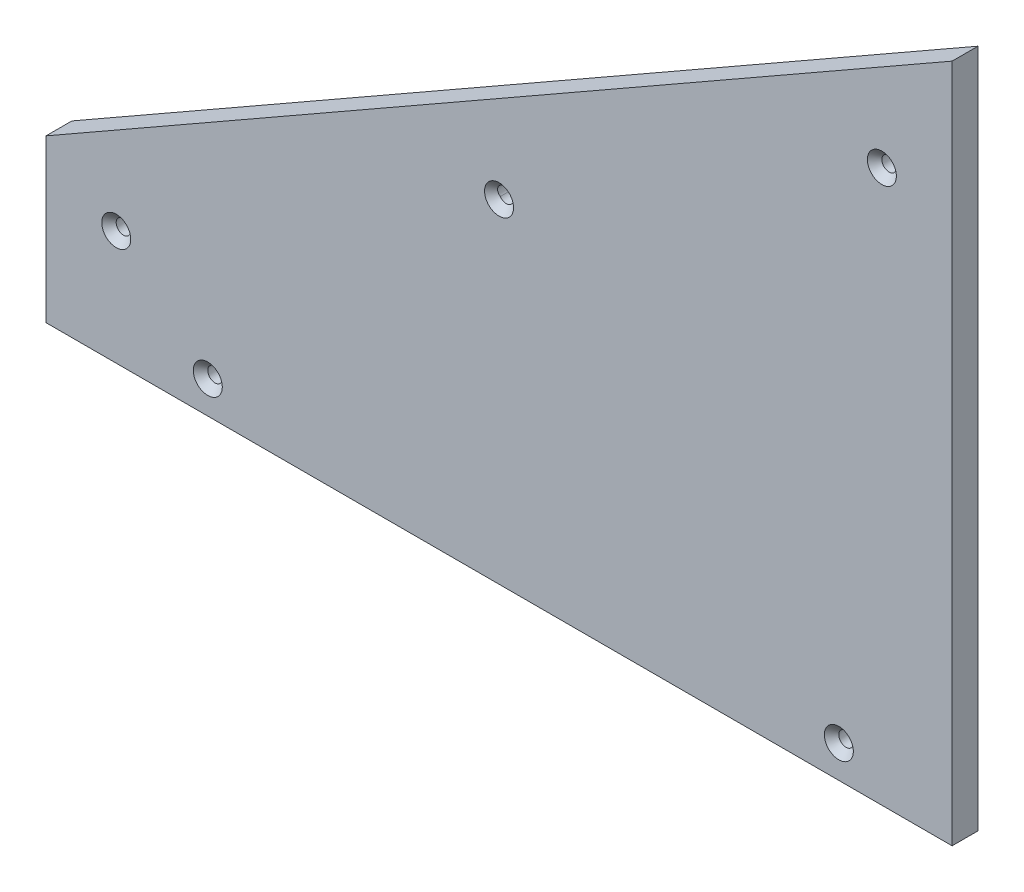
ISO-10303-21;
HEADER;
FILE_DESCRIPTION(('STEP AP214'),'2;1');
FILE_NAME('part.step','',(''),(''),'','','');
FILE_SCHEMA(('AUTOMOTIVE_DESIGN { 1 0 10303 214 1 1 1 1 }'));
ENDSEC;
DATA;
#1=APPLICATION_CONTEXT('core data for automotive mechanical design processes');
#2=APPLICATION_PROTOCOL_DEFINITION('international standard','automotive_design',2000,#1);
#3=PRODUCT_CONTEXT('',#1,'mechanical');
#4=PRODUCT('Part','Part','',(#3));
#5=PRODUCT_RELATED_PRODUCT_CATEGORY('part','',(#4));
#6=PRODUCT_DEFINITION_FORMATION('','',#4);
#7=PRODUCT_DEFINITION_CONTEXT('part definition',#1,'design');
#8=PRODUCT_DEFINITION('design','',#6,#7);
#9=PRODUCT_DEFINITION_SHAPE('','',#8);
#10=(LENGTH_UNIT() NAMED_UNIT(*) SI_UNIT(.MILLI.,.METRE.));
#11=(NAMED_UNIT(*) PLANE_ANGLE_UNIT() SI_UNIT($,.RADIAN.));
#12=(NAMED_UNIT(*) SI_UNIT($,.STERADIAN.) SOLID_ANGLE_UNIT());
#13=UNCERTAINTY_MEASURE_WITH_UNIT(LENGTH_MEASURE(1.E-05),#10,'distance_accuracy_value','');
#14=(GEOMETRIC_REPRESENTATION_CONTEXT(3) GLOBAL_UNCERTAINTY_ASSIGNED_CONTEXT((#13)) GLOBAL_UNIT_ASSIGNED_CONTEXT((#10,
#11,#12)) REPRESENTATION_CONTEXT('',''));
#15=CARTESIAN_POINT('',(0.,0.,0.));
#16=DIRECTION('',(0.,0.,1.));
#17=DIRECTION('',(1.,0.,0.));
#18=AXIS2_PLACEMENT_3D('',#15,#16,#17);
#19=CARTESIAN_POINT('',(0.,0.,0.));
#20=DIRECTION('',(0.,0.,1.));
#21=DIRECTION('',(1.,0.,0.));
#22=AXIS2_PLACEMENT_3D('',#19,#20,#21);
#23=PLANE('',#22);
#24=CARTESIAN_POINT('',(139.792651332237,103.260866722493,0.));
#25=DIRECTION('',(0.,0.,-1.));
#26=DIRECTION('',(-1.,0.,0.));
#27=AXIS2_PLACEMENT_3D('',#24,#25,#26);
#28=CIRCLE('',#27,4.48000000000001);
#29=CARTESIAN_POINT('',(135.312651332237,103.260866722493,0.));
#30=VERTEX_POINT('',#29);
#31=EDGE_CURVE('E363',#30,#30,#28,.T.);
#32=ORIENTED_EDGE('',*,*,#31,.F.);
#33=EDGE_LOOP('',(#32));
#34=FACE_BOUND('',#33,.T.);
#35=DIRECTION('',(0.,1.,0.));
#36=VECTOR('',#35,1.);
#37=CARTESIAN_POINT('',(0.,0.,0.));
#38=LINE('',#37,#36);
#39=CARTESIAN_POINT('',(0.,0.,0.));
#40=VERTEX_POINT('',#39);
#41=CARTESIAN_POINT('',(0.,50.,0.));
#42=VERTEX_POINT('',#41);
#43=EDGE_CURVE('E87',#40,#42,#38,.T.);
#44=ORIENTED_EDGE('',*,*,#43,.T.);
#45=DIRECTION('',(-0.868243142124459,-0.496138938356834,0.));
#46=VECTOR('',#45,1.);
#47=CARTESIAN_POINT('',(0.,50.,0.));
#48=LINE('',#47,#46);
#49=CARTESIAN_POINT('',(280.,210.,0.));
#50=VERTEX_POINT('',#49);
#51=EDGE_CURVE('E100',#50,#42,#48,.T.);
#52=ORIENTED_EDGE('',*,*,#51,.F.);
#53=DIRECTION('',(0.,1.,0.));
#54=VECTOR('',#53,1.);
#55=CARTESIAN_POINT('',(280.,0.,0.));
#56=LINE('',#55,#54);
#57=CARTESIAN_POINT('',(280.,0.,0.));
#58=VERTEX_POINT('',#57);
#59=EDGE_CURVE('E86',#58,#50,#56,.T.);
#60=ORIENTED_EDGE('',*,*,#59,.F.);
#61=DIRECTION('',(1.,0.,0.));
#62=VECTOR('',#61,1.);
#63=CARTESIAN_POINT('',(0.,0.,0.));
#64=LINE('',#63,#62);
#65=EDGE_CURVE('E76',#40,#58,#64,.T.);
#66=ORIENTED_EDGE('',*,*,#65,.F.);
#67=EDGE_LOOP('',(#44,#52,#60,#66));
#68=FACE_BOUND('',#67,.T.);
#69=CARTESIAN_POINT('',(245.,10.,0.));
#70=DIRECTION('',(0.,0.,-1.));
#71=DIRECTION('',(-1.,0.,0.));
#72=AXIS2_PLACEMENT_3D('',#69,#70,#71);
#73=CIRCLE('',#72,4.48000000000001);
#74=CARTESIAN_POINT('',(240.52,10.,0.));
#75=VERTEX_POINT('',#74);
#76=EDGE_CURVE('E386',#75,#75,#73,.T.);
#77=ORIENTED_EDGE('',*,*,#76,.F.);
#78=EDGE_LOOP('',(#77));
#79=FACE_BOUND('',#78,.T.);
#80=CARTESIAN_POINT('',(50.,10.,0.));
#81=DIRECTION('',(0.,0.,-1.));
#82=DIRECTION('',(-1.,0.,0.));
#83=AXIS2_PLACEMENT_3D('',#80,#81,#82);
#84=CIRCLE('',#83,4.48);
#85=CARTESIAN_POINT('',(45.52,10.,0.));
#86=VERTEX_POINT('',#85);
#87=EDGE_CURVE('E380',#86,#86,#84,.T.);
#88=ORIENTED_EDGE('',*,*,#87,.F.);
#89=EDGE_LOOP('',(#88));
#90=FACE_BOUND('',#89,.T.);
#91=CARTESIAN_POINT('',(21.7060785531115,35.4034734589208,0.));
#92=DIRECTION('',(0.,0.,-1.));
#93=DIRECTION('',(-1.,0.,0.));
#94=AXIS2_PLACEMENT_3D('',#91,#92,#93);
#95=CIRCLE('',#94,4.48);
#96=CARTESIAN_POINT('',(17.2260785531115,35.4034734589208,0.));
#97=VERTEX_POINT('',#96);
#98=EDGE_CURVE('E374',#97,#97,#95,.T.);
#99=ORIENTED_EDGE('',*,*,#98,.F.);
#100=EDGE_LOOP('',(#99));
#101=FACE_BOUND('',#100,.T.);
#102=CARTESIAN_POINT('',(258.293921446889,170.596526541079,0.));
#103=DIRECTION('',(0.,0.,-1.));
#104=DIRECTION('',(-1.,0.,0.));
#105=AXIS2_PLACEMENT_3D('',#102,#103,#104);
#106=CIRCLE('',#105,4.47999999999998);
#107=CARTESIAN_POINT('',(253.813921446889,170.596526541079,0.));
#108=VERTEX_POINT('',#107);
#109=EDGE_CURVE('E368',#108,#108,#106,.T.);
#110=ORIENTED_EDGE('',*,*,#109,.F.);
#111=EDGE_LOOP('',(#110));
#112=FACE_BOUND('',#111,.T.);
#113=ADVANCED_FACE('F34',(#34,#68,#79,#90,#101,#112),#23,.F.);
#114=CARTESIAN_POINT('',(0.,0.,8.));
#115=DIRECTION('',(-1.,0.,0.));
#116=DIRECTION('',(0.,0.,1.));
#117=AXIS2_PLACEMENT_3D('',#114,#115,#116);
#118=PLANE('',#117);
#119=ORIENTED_EDGE('',*,*,#43,.F.);
#120=DIRECTION('',(0.,0.,-1.));
#121=VECTOR('',#120,1.);
#122=CARTESIAN_POINT('',(0.,0.,8.));
#123=LINE('',#122,#121);
#124=CARTESIAN_POINT('',(0.,0.,8.));
#125=VERTEX_POINT('',#124);
#126=EDGE_CURVE('E81',#125,#40,#123,.T.);
#127=ORIENTED_EDGE('',*,*,#126,.F.);
#128=DIRECTION('',(0.,1.,0.));
#129=VECTOR('',#128,1.);
#130=CARTESIAN_POINT('',(0.,0.,8.));
#131=LINE('',#130,#129);
#132=CARTESIAN_POINT('',(0.,50.,8.));
#133=VERTEX_POINT('',#132);
#134=EDGE_CURVE('E101',#125,#133,#131,.T.);
#135=ORIENTED_EDGE('',*,*,#134,.T.);
#136=DIRECTION('',(0.,0.,1.));
#137=VECTOR('',#136,1.);
#138=CARTESIAN_POINT('',(0.,50.,0.));
#139=LINE('',#138,#137);
#140=EDGE_CURVE('E409',#42,#133,#139,.T.);
#141=ORIENTED_EDGE('',*,*,#140,.F.);
#142=EDGE_LOOP('',(#119,#127,#135,#141));
#143=FACE_BOUND('',#142,.T.);
#144=ADVANCED_FACE('F36',(#143),#118,.T.);
#145=CARTESIAN_POINT('',(0.,0.,8.));
#146=DIRECTION('',(0.,1.,0.));
#147=DIRECTION('',(0.,0.,1.));
#148=AXIS2_PLACEMENT_3D('',#145,#146,#147);
#149=PLANE('',#148);
#150=ORIENTED_EDGE('',*,*,#65,.T.);
#151=DIRECTION('',(0.,0.,-1.));
#152=VECTOR('',#151,1.);
#153=CARTESIAN_POINT('',(280.,0.,8.));
#154=LINE('',#153,#152);
#155=CARTESIAN_POINT('',(280.,0.,8.));
#156=VERTEX_POINT('',#155);
#157=EDGE_CURVE('E79',#156,#58,#154,.T.);
#158=ORIENTED_EDGE('',*,*,#157,.F.);
#159=DIRECTION('',(1.,0.,0.));
#160=VECTOR('',#159,1.);
#161=CARTESIAN_POINT('',(0.,0.,8.));
#162=LINE('',#161,#160);
#163=EDGE_CURVE('E63',#125,#156,#162,.T.);
#164=ORIENTED_EDGE('',*,*,#163,.F.);
#165=ORIENTED_EDGE('',*,*,#126,.T.);
#166=EDGE_LOOP('',(#150,#158,#164,#165));
#167=FACE_BOUND('',#166,.T.);
#168=ADVANCED_FACE('F78',(#167),#149,.F.);
#169=CARTESIAN_POINT('',(280.,0.,8.));
#170=DIRECTION('',(-1.,0.,0.));
#171=DIRECTION('',(0.,0.,1.));
#172=AXIS2_PLACEMENT_3D('',#169,#170,#171);
#173=PLANE('',#172);
#174=ORIENTED_EDGE('',*,*,#59,.T.);
#175=DIRECTION('',(0.,0.,1.));
#176=VECTOR('',#175,1.);
#177=CARTESIAN_POINT('',(280.,210.,0.));
#178=LINE('',#177,#176);
#179=CARTESIAN_POINT('',(280.,210.,8.));
#180=VERTEX_POINT('',#179);
#181=EDGE_CURVE('E406',#50,#180,#178,.T.);
#182=ORIENTED_EDGE('',*,*,#181,.T.);
#183=DIRECTION('',(0.,1.,0.));
#184=VECTOR('',#183,1.);
#185=CARTESIAN_POINT('',(280.,0.,8.));
#186=LINE('',#185,#184);
#187=EDGE_CURVE('E95',#156,#180,#186,.T.);
#188=ORIENTED_EDGE('',*,*,#187,.F.);
#189=ORIENTED_EDGE('',*,*,#157,.T.);
#190=EDGE_LOOP('',(#174,#182,#188,#189));
#191=FACE_BOUND('',#190,.T.);
#192=ADVANCED_FACE('F91',(#191),#173,.F.);
#193=CARTESIAN_POINT('',(0.,0.,8.));
#194=DIRECTION('',(0.,0.,1.));
#195=DIRECTION('',(1.,0.,0.));
#196=AXIS2_PLACEMENT_3D('',#193,#194,#195);
#197=PLANE('',#196);
#198=CARTESIAN_POINT('',(140.,103.,8.));
#199=DIRECTION('',(0.,0.,1.));
#200=DIRECTION('',(1.,0.,0.));
#201=AXIS2_PLACEMENT_3D('',#198,#199,#200);
#202=CIRCLE('',#201,4.48000000000001);
#203=CARTESIAN_POINT('',(144.48,103.,8.));
#204=VERTEX_POINT('',#203);
#205=EDGE_CURVE('E357',#204,#204,#202,.T.);
#206=ORIENTED_EDGE('',*,*,#205,.F.);
#207=EDGE_LOOP('',(#206));
#208=FACE_BOUND('',#207,.T.);
#209=CARTESIAN_POINT('',(21.7060785531115,35.4034734589208,8.));
#210=DIRECTION('',(0.,0.,1.));
#211=DIRECTION('',(1.,0.,0.));
#212=AXIS2_PLACEMENT_3D('',#209,#210,#211);
#213=CIRCLE('',#212,4.48);
#214=CARTESIAN_POINT('',(26.1860785531115,35.4034734589208,8.));
#215=VERTEX_POINT('',#214);
#216=EDGE_CURVE('E392',#215,#215,#213,.T.);
#217=ORIENTED_EDGE('',*,*,#216,.F.);
#218=EDGE_LOOP('',(#217));
#219=FACE_BOUND('',#218,.T.);
#220=CARTESIAN_POINT('',(258.293921446889,170.596526541079,8.));
#221=DIRECTION('',(0.,0.,1.));
#222=DIRECTION('',(1.,0.,0.));
#223=AXIS2_PLACEMENT_3D('',#220,#221,#222);
#224=CIRCLE('',#223,4.47999999999998);
#225=CARTESIAN_POINT('',(262.773921446889,170.596526541079,8.));
#226=VERTEX_POINT('',#225);
#227=EDGE_CURVE('E398',#226,#226,#224,.T.);
#228=ORIENTED_EDGE('',*,*,#227,.F.);
#229=EDGE_LOOP('',(#228));
#230=FACE_BOUND('',#229,.T.);
#231=CARTESIAN_POINT('',(50.,10.,8.));
#232=DIRECTION('',(0.,0.,1.));
#233=DIRECTION('',(1.,0.,0.));
#234=AXIS2_PLACEMENT_3D('',#231,#232,#233);
#235=CIRCLE('',#234,4.48);
#236=CARTESIAN_POINT('',(54.48,10.,8.));
#237=VERTEX_POINT('',#236);
#238=EDGE_CURVE('E412',#237,#237,#235,.T.);
#239=ORIENTED_EDGE('',*,*,#238,.F.);
#240=EDGE_LOOP('',(#239));
#241=FACE_BOUND('',#240,.T.);
#242=CARTESIAN_POINT('',(245.,10.,8.));
#243=DIRECTION('',(0.,0.,1.));
#244=DIRECTION('',(1.,0.,0.));
#245=AXIS2_PLACEMENT_3D('',#242,#243,#244);
#246=CIRCLE('',#245,4.48000000000001);
#247=CARTESIAN_POINT('',(249.48,10.,8.));
#248=VERTEX_POINT('',#247);
#249=EDGE_CURVE('E419',#248,#248,#246,.T.);
#250=ORIENTED_EDGE('',*,*,#249,.F.);
#251=EDGE_LOOP('',(#250));
#252=FACE_BOUND('',#251,.T.);
#253=ORIENTED_EDGE('',*,*,#187,.T.);
#254=DIRECTION('',(-0.868243142124459,-0.496138938356834,0.));
#255=VECTOR('',#254,1.);
#256=CARTESIAN_POINT('',(0.,50.,8.));
#257=LINE('',#256,#255);
#258=EDGE_CURVE('E404',#180,#133,#257,.T.);
#259=ORIENTED_EDGE('',*,*,#258,.T.);
#260=ORIENTED_EDGE('',*,*,#134,.F.);
#261=ORIENTED_EDGE('',*,*,#163,.T.);
#262=EDGE_LOOP('',(#253,#259,#260,#261));
#263=FACE_BOUND('',#262,.T.);
#264=ADVANCED_FACE('F138',(#208,#219,#230,#241,#252,#263),#197,.T.);
#265=CARTESIAN_POINT('',(245.,10.,8.));
#266=DIRECTION('',(0.,0.,1.));
#267=DIRECTION('',(1.,0.,0.));
#268=AXIS2_PLACEMENT_3D('',#265,#266,#267);
#269=CYLINDRICAL_SURFACE('',#268,2.25);
#270=CARTESIAN_POINT('',(245.,10.,2.23000000000001));
#271=DIRECTION('',(0.,0.,-1.));
#272=DIRECTION('',(-1.,0.,0.));
#273=AXIS2_PLACEMENT_3D('',#270,#271,#272);
#274=CIRCLE('',#273,2.25);
#275=CARTESIAN_POINT('',(242.75,10.,2.23000000000001));
#276=VERTEX_POINT('',#275);
#277=EDGE_CURVE('E389',#276,#276,#274,.T.);
#278=ORIENTED_EDGE('',*,*,#277,.T.);
#279=EDGE_LOOP('',(#278));
#280=FACE_BOUND('',#279,.T.);
#281=CARTESIAN_POINT('',(245.,10.,5.76999999999999));
#282=DIRECTION('',(0.,0.,1.));
#283=DIRECTION('',(1.,0.,0.));
#284=AXIS2_PLACEMENT_3D('',#281,#282,#283);
#285=CIRCLE('',#284,2.25);
#286=CARTESIAN_POINT('',(247.25,10.,5.76999999999999));
#287=VERTEX_POINT('',#286);
#288=EDGE_CURVE('E422',#287,#287,#285,.T.);
#289=ORIENTED_EDGE('',*,*,#288,.T.);
#290=EDGE_LOOP('',(#289));
#291=FACE_BOUND('',#290,.T.);
#292=ADVANCED_FACE('F158',(#280,#291),#269,.F.);
#293=CARTESIAN_POINT('',(245.,10.,8.));
#294=DIRECTION('',(0.,0.,1.));
#295=DIRECTION('',(1.,0.,0.));
#296=AXIS2_PLACEMENT_3D('',#293,#294,#295);
#297=CONICAL_SURFACE('',#296,4.48000000000001,0.785398163397448);
#298=ORIENTED_EDGE('',*,*,#288,.F.);
#299=EDGE_LOOP('',(#298));
#300=FACE_BOUND('',#299,.T.);
#301=ORIENTED_EDGE('',*,*,#249,.T.);
#302=EDGE_LOOP('',(#301));
#303=FACE_BOUND('',#302,.T.);
#304=ADVANCED_FACE('F166',(#300,#303),#297,.F.);
#305=CARTESIAN_POINT('',(50.,10.,8.));
#306=DIRECTION('',(0.,0.,1.));
#307=DIRECTION('',(1.,0.,0.));
#308=AXIS2_PLACEMENT_3D('',#305,#306,#307);
#309=CYLINDRICAL_SURFACE('',#308,2.25);
#310=CARTESIAN_POINT('',(50.,10.,2.23000000000001));
#311=DIRECTION('',(0.,0.,-1.));
#312=DIRECTION('',(-1.,0.,0.));
#313=AXIS2_PLACEMENT_3D('',#310,#311,#312);
#314=CIRCLE('',#313,2.24999999999999);
#315=CARTESIAN_POINT('',(47.75,10.,2.23000000000001));
#316=VERTEX_POINT('',#315);
#317=EDGE_CURVE('E383',#316,#316,#314,.T.);
#318=ORIENTED_EDGE('',*,*,#317,.T.);
#319=EDGE_LOOP('',(#318));
#320=FACE_BOUND('',#319,.T.);
#321=CARTESIAN_POINT('',(50.,10.,5.76999999999999));
#322=DIRECTION('',(0.,0.,1.));
#323=DIRECTION('',(1.,0.,0.));
#324=AXIS2_PLACEMENT_3D('',#321,#322,#323);
#325=CIRCLE('',#324,2.24999999999999);
#326=CARTESIAN_POINT('',(52.25,10.,5.76999999999999));
#327=VERTEX_POINT('',#326);
#328=EDGE_CURVE('E416',#327,#327,#325,.T.);
#329=ORIENTED_EDGE('',*,*,#328,.T.);
#330=EDGE_LOOP('',(#329));
#331=FACE_BOUND('',#330,.T.);
#332=ADVANCED_FACE('F174',(#320,#331),#309,.F.);
#333=CARTESIAN_POINT('',(50.,10.,8.));
#334=DIRECTION('',(0.,0.,1.));
#335=DIRECTION('',(1.,0.,0.));
#336=AXIS2_PLACEMENT_3D('',#333,#334,#335);
#337=CONICAL_SURFACE('',#336,4.48,0.785398163397448);
#338=ORIENTED_EDGE('',*,*,#328,.F.);
#339=EDGE_LOOP('',(#338));
#340=FACE_BOUND('',#339,.T.);
#341=ORIENTED_EDGE('',*,*,#238,.T.);
#342=EDGE_LOOP('',(#341));
#343=FACE_BOUND('',#342,.T.);
#344=ADVANCED_FACE('F183',(#340,#343),#337,.F.);
#345=CARTESIAN_POINT('',(0.,50.,0.));
#346=DIRECTION('',(-0.496138938356834,0.868243142124459,0.));
#347=DIRECTION('',(-0.868243142124459,-0.496138938356834,0.));
#348=AXIS2_PLACEMENT_3D('',#345,#346,#347);
#349=PLANE('',#348);
#350=ORIENTED_EDGE('',*,*,#258,.F.);
#351=ORIENTED_EDGE('',*,*,#181,.F.);
#352=ORIENTED_EDGE('',*,*,#51,.T.);
#353=ORIENTED_EDGE('',*,*,#140,.T.);
#354=EDGE_LOOP('',(#350,#351,#352,#353));
#355=FACE_BOUND('',#354,.T.);
#356=ADVANCED_FACE('F191',(#355),#349,.T.);
#357=CARTESIAN_POINT('',(258.293921446889,170.596526541079,8.));
#358=DIRECTION('',(0.,0.,1.));
#359=DIRECTION('',(1.,0.,0.));
#360=AXIS2_PLACEMENT_3D('',#357,#358,#359);
#361=CYLINDRICAL_SURFACE('',#360,2.24999999999997);
#362=CARTESIAN_POINT('',(258.293921446889,170.596526541079,2.23000000000001));
#363=DIRECTION('',(0.,0.,-1.));
#364=DIRECTION('',(-1.,0.,0.));
#365=AXIS2_PLACEMENT_3D('',#362,#363,#364);
#366=CIRCLE('',#365,2.24999999999997);
#367=CARTESIAN_POINT('',(256.043921446889,170.596526541079,2.23000000000001));
#368=VERTEX_POINT('',#367);
#369=EDGE_CURVE('E371',#368,#368,#366,.T.);
#370=ORIENTED_EDGE('',*,*,#369,.T.);
#371=EDGE_LOOP('',(#370));
#372=FACE_BOUND('',#371,.T.);
#373=CARTESIAN_POINT('',(258.293921446889,170.596526541079,5.77));
#374=DIRECTION('',(0.,0.,1.));
#375=DIRECTION('',(1.,0.,0.));
#376=AXIS2_PLACEMENT_3D('',#373,#374,#375);
#377=CIRCLE('',#376,2.24999999999997);
#378=CARTESIAN_POINT('',(260.543921446889,170.596526541079,5.77));
#379=VERTEX_POINT('',#378);
#380=EDGE_CURVE('E401',#379,#379,#377,.T.);
#381=ORIENTED_EDGE('',*,*,#380,.T.);
#382=EDGE_LOOP('',(#381));
#383=FACE_BOUND('',#382,.T.);
#384=ADVANCED_FACE('F198',(#372,#383),#361,.F.);
#385=CARTESIAN_POINT('',(258.293921446889,170.596526541079,8.));
#386=DIRECTION('',(0.,0.,1.));
#387=DIRECTION('',(1.,0.,0.));
#388=AXIS2_PLACEMENT_3D('',#385,#386,#387);
#389=CONICAL_SURFACE('',#388,4.47999999999998,0.78539816339745);
#390=ORIENTED_EDGE('',*,*,#380,.F.);
#391=EDGE_LOOP('',(#390));
#392=FACE_BOUND('',#391,.T.);
#393=ORIENTED_EDGE('',*,*,#227,.T.);
#394=EDGE_LOOP('',(#393));
#395=FACE_BOUND('',#394,.T.);
#396=ADVANCED_FACE('F206',(#392,#395),#389,.F.);
#397=CARTESIAN_POINT('',(21.7060785531115,35.4034734589208,8.));
#398=DIRECTION('',(0.,0.,1.));
#399=DIRECTION('',(1.,0.,0.));
#400=AXIS2_PLACEMENT_3D('',#397,#398,#399);
#401=CYLINDRICAL_SURFACE('',#400,2.25);
#402=CARTESIAN_POINT('',(21.7060785531115,35.4034734589208,2.23000000000001));
#403=DIRECTION('',(0.,0.,-1.));
#404=DIRECTION('',(-1.,0.,0.));
#405=AXIS2_PLACEMENT_3D('',#402,#403,#404);
#406=CIRCLE('',#405,2.24999999999999);
#407=CARTESIAN_POINT('',(19.4560785531115,35.4034734589208,2.23000000000001));
#408=VERTEX_POINT('',#407);
#409=EDGE_CURVE('E377',#408,#408,#406,.T.);
#410=ORIENTED_EDGE('',*,*,#409,.T.);
#411=EDGE_LOOP('',(#410));
#412=FACE_BOUND('',#411,.T.);
#413=CARTESIAN_POINT('',(21.7060785531115,35.4034734589208,5.77));
#414=DIRECTION('',(0.,0.,1.));
#415=DIRECTION('',(1.,0.,0.));
#416=AXIS2_PLACEMENT_3D('',#413,#414,#415);
#417=CIRCLE('',#416,2.25);
#418=CARTESIAN_POINT('',(23.9560785531115,35.4034734589208,5.77));
#419=VERTEX_POINT('',#418);
#420=EDGE_CURVE('E395',#419,#419,#417,.T.);
#421=ORIENTED_EDGE('',*,*,#420,.T.);
#422=EDGE_LOOP('',(#421));
#423=FACE_BOUND('',#422,.T.);
#424=ADVANCED_FACE('F214',(#412,#423),#401,.F.);
#425=CARTESIAN_POINT('',(21.7060785531115,35.4034734589208,8.));
#426=DIRECTION('',(0.,0.,1.));
#427=DIRECTION('',(1.,0.,0.));
#428=AXIS2_PLACEMENT_3D('',#425,#426,#427);
#429=CONICAL_SURFACE('',#428,4.48,0.785398163397449);
#430=ORIENTED_EDGE('',*,*,#420,.F.);
#431=EDGE_LOOP('',(#430));
#432=FACE_BOUND('',#431,.T.);
#433=ORIENTED_EDGE('',*,*,#216,.T.);
#434=EDGE_LOOP('',(#433));
#435=FACE_BOUND('',#434,.T.);
#436=ADVANCED_FACE('F221',(#432,#435),#429,.F.);
#437=CARTESIAN_POINT('',(245.,10.,0.));
#438=DIRECTION('',(0.,0.,-1.));
#439=DIRECTION('',(-1.,0.,0.));
#440=AXIS2_PLACEMENT_3D('',#437,#438,#439);
#441=CONICAL_SURFACE('',#440,4.48000000000001,0.785398163397448);
#442=ORIENTED_EDGE('',*,*,#277,.F.);
#443=EDGE_LOOP('',(#442));
#444=FACE_BOUND('',#443,.T.);
#445=ORIENTED_EDGE('',*,*,#76,.T.);
#446=EDGE_LOOP('',(#445));
#447=FACE_BOUND('',#446,.T.);
#448=ADVANCED_FACE('F229',(#444,#447),#441,.F.);
#449=CARTESIAN_POINT('',(50.,10.,0.));
#450=DIRECTION('',(0.,0.,-1.));
#451=DIRECTION('',(-1.,0.,0.));
#452=AXIS2_PLACEMENT_3D('',#449,#450,#451);
#453=CONICAL_SURFACE('',#452,4.48,0.785398163397448);
#454=ORIENTED_EDGE('',*,*,#317,.F.);
#455=EDGE_LOOP('',(#454));
#456=FACE_BOUND('',#455,.T.);
#457=ORIENTED_EDGE('',*,*,#87,.T.);
#458=EDGE_LOOP('',(#457));
#459=FACE_BOUND('',#458,.T.);
#460=ADVANCED_FACE('F236',(#456,#459),#453,.F.);
#461=CARTESIAN_POINT('',(21.7060785531115,35.4034734589208,0.));
#462=DIRECTION('',(0.,0.,-1.));
#463=DIRECTION('',(-1.,0.,0.));
#464=AXIS2_PLACEMENT_3D('',#461,#462,#463);
#465=CONICAL_SURFACE('',#464,4.48,0.785398163397449);
#466=ORIENTED_EDGE('',*,*,#409,.F.);
#467=EDGE_LOOP('',(#466));
#468=FACE_BOUND('',#467,.T.);
#469=ORIENTED_EDGE('',*,*,#98,.T.);
#470=EDGE_LOOP('',(#469));
#471=FACE_BOUND('',#470,.T.);
#472=ADVANCED_FACE('F243',(#468,#471),#465,.F.);
#473=CARTESIAN_POINT('',(258.293921446889,170.596526541079,0.));
#474=DIRECTION('',(0.,0.,-1.));
#475=DIRECTION('',(-1.,0.,0.));
#476=AXIS2_PLACEMENT_3D('',#473,#474,#475);
#477=CONICAL_SURFACE('',#476,4.47999999999998,0.785398163397448);
#478=ORIENTED_EDGE('',*,*,#369,.F.);
#479=EDGE_LOOP('',(#478));
#480=FACE_BOUND('',#479,.T.);
#481=ORIENTED_EDGE('',*,*,#109,.T.);
#482=EDGE_LOOP('',(#481));
#483=FACE_BOUND('',#482,.T.);
#484=ADVANCED_FACE('F251',(#480,#483),#477,.F.);
#485=CARTESIAN_POINT('',(139.792651332237,103.260866722493,0.));
#486=DIRECTION('',(0.,0.,-1.));
#487=DIRECTION('',(-1.,0.,0.));
#488=AXIS2_PLACEMENT_3D('',#485,#486,#487);
#489=CYLINDRICAL_SURFACE('',#488,2.24999999999999);
#490=CARTESIAN_POINT('',(142.014092710247,103.618215577347,5.62683647812157));
#491=CARTESIAN_POINT('',(142.005515994241,103.671531219022,5.63428224995144));
#492=CARTESIAN_POINT('',(141.995024735681,103.72450527362,5.64183428295746));
#493=CARTESIAN_POINT('',(141.970271262398,103.829535488644,5.65711101410851));
#494=CARTESIAN_POINT('',(141.956009319731,103.881591715003,5.66483569975982));
#495=CARTESIAN_POINT('',(141.907758972892,104.035702622226,5.6881590669389));
#496=CARTESIAN_POINT('',(141.868248492007,104.136055136751,5.7039568204935));
#497=CARTESIAN_POINT('',(141.773145119358,104.334563163141,5.7364609821096));
#498=CARTESIAN_POINT('',(141.716888149271,104.432397965635,5.75317540779757));
#499=CARTESIAN_POINT('',(141.591731249435,104.616570847915,5.78606532450301));
#500=CARTESIAN_POINT('',(141.52313081491,104.703111688285,5.80224465628069));
#501=CARTESIAN_POINT('',(141.373861697596,104.865375831185,5.83413095445944));
#502=CARTESIAN_POINT('',(141.293176744557,104.941084276386,5.84983724919988));
#503=CARTESIAN_POINT('',(141.107884662131,105.090891609277,5.88288390890583));
#504=CARTESIAN_POINT('',(141.001511734997,105.162851328477,5.90009103329099));
#505=CARTESIAN_POINT('',(140.777912440707,105.287728104277,5.93302983752665));
#506=CARTESIAN_POINT('',(140.660684949888,105.340643186603,5.94876136428346));
#507=CARTESIAN_POINT('',(140.419439875676,105.425558106855,5.97829744477771));
#508=CARTESIAN_POINT('',(140.295466564302,105.457679824856,5.9921128476817));
#509=CARTESIAN_POINT('',(140.043661562126,105.500465139939,6.01761645858034));
#510=CARTESIAN_POINT('',(139.915830164638,105.511130364122,6.02930482781241));
#511=CARTESIAN_POINT('',(139.661136722768,105.510595498259,6.0502076896172));
#512=CARTESIAN_POINT('',(139.53427598342,105.499585909448,6.05944293333173));
#513=CARTESIAN_POINT('',(139.284068788613,105.456307612867,6.0753769537682));
#514=CARTESIAN_POINT('',(139.160722190604,105.424039768714,6.08207583351258));
#515=CARTESIAN_POINT('',(138.922103757076,105.339458019983,6.0927529365162));
#516=CARTESIAN_POINT('',(138.806774843788,105.28730781067,6.09675265661306));
#517=CARTESIAN_POINT('',(138.586431125478,105.164401725712,6.10203527417767));
#518=CARTESIAN_POINT('',(138.481415972669,105.093646477736,6.10331826328551));
#519=CARTESIAN_POINT('',(138.285190267769,104.935928300949,6.10314162219563));
#520=CARTESIAN_POINT('',(138.193916316572,104.849044214284,6.10169503242439));
#521=CARTESIAN_POINT('',(138.02715908287,104.661330211016,6.0961145552288));
#522=CARTESIAN_POINT('',(137.951675715615,104.560500369264,6.0919806822278));
#523=CARTESIAN_POINT('',(137.818612545878,104.347792336483,6.08111076962813));
#524=CARTESIAN_POINT('',(137.761030927322,104.235915267678,6.0743749941396));
#525=CARTESIAN_POINT('',(137.665325348677,104.004295683063,6.05843974996734));
#526=CARTESIAN_POINT('',(137.62720138398,103.884553169116,6.04924028186709));
#527=CARTESIAN_POINT('',(137.571271019672,103.640036488372,6.0285211815154));
#528=CARTESIAN_POINT('',(137.553557119737,103.5152420468,6.01699126247911));
#529=CARTESIAN_POINT('',(137.539156329021,103.264642786159,5.99188000251447));
#530=CARTESIAN_POINT('',(137.542471698998,103.138837859909,5.97829844117692));
#531=CARTESIAN_POINT('',(137.570045195625,102.888741265447,5.94926237054433));
#532=CARTESIAN_POINT('',(137.594470036404,102.764469650988,5.93379379569848));
#533=CARTESIAN_POINT('',(137.663706655917,102.521957830052,5.90141986143296));
#534=CARTESIAN_POINT('',(137.708513997265,102.403716317015,5.88451481539228));
#535=CARTESIAN_POINT('',(137.811455806367,102.188447413451,5.85149479217311));
#536=CARTESIAN_POINT('',(137.867703770766,102.090495073895,5.83548240592306));
#537=CARTESIAN_POINT('',(137.994153947815,101.904193109908,5.80294091116013));
#538=CARTESIAN_POINT('',(138.064348002878,101.815837918261,5.78641210945878));
#539=CARTESIAN_POINT('',(138.197294145133,101.672065570224,5.75748879955632));
#540=CARTESIAN_POINT('',(138.257267846805,101.61404316133,5.74513184431065));
#541=CARTESIAN_POINT('',(138.383224938193,101.505030330218,5.72047842808785));
#542=CARTESIAN_POINT('',(138.449203614872,101.454034470872,5.70818192751755));
#543=CARTESIAN_POINT('',(138.517851919704,101.406847721024,5.69598187398943));
#544=B_SPLINE_CURVE_WITH_KNOTS('',3,(#490,#491,#492,#493,#494,#495,#496,#497,#498,#499,#500,
#501,#502,#503,#504,#505,#506,#507,#508,#509,#510,#511,#512,#513,#514,#515,#516,#517,#518,#519,
#520,#521,#522,#523,#524,#525,#526,#527,#528,#529,#530,#531,#532,#533,#534,#535,#536,#537,#538,
#539,#540,#541,#542,#543),.UNSPECIFIED.,.F.,.F.,(4,2,2,2,2,2,2,2,2,2,2,2,2,2,2,2,2,2,2,2,2,2,2,
2,2,2,4),(0.,0.163464901105582,0.326918011391027,0.65274323653301,0.993763410524441,
1.32741392805563,1.66151776986571,2.04834288918339,2.43520809743258,2.8197846593866,
3.20433205678755,3.5855147302441,3.96668191910055,4.34477638545775,4.72285809782109,
5.0991381156708,5.4754161139466,5.85165592757441,6.22789565209673,6.60583389328067,
6.98381276551641,7.36480432756506,7.74571298526201,8.08674099102195,8.42757010100978,
8.68015785938595,8.93254905489461),.UNSPECIFIED.);
#545=CARTESIAN_POINT('',(141.652864723634,104.526610037097,5.76999999999999));
#546=VERTEX_POINT('',#545);
#547=CARTESIAN_POINT('',(138.139786608603,101.734256685396,5.76999999999999));
#548=VERTEX_POINT('',#547);
#549=EDGE_CURVE('E11',#546,#548,#544,.T.);
#550=ORIENTED_EDGE('',*,*,#549,.T.);
#551=DIRECTION('',(0.,0.,1.));
#552=VECTOR('',#551,1.);
#553=CARTESIAN_POINT('',(138.139786608603,101.734256685396,4.));
#554=LINE('',#553,#552);
#555=CARTESIAN_POINT('',(138.139786608603,101.734256685396,2.23000000000001));
#556=VERTEX_POINT('',#555);
#557=EDGE_CURVE('E350',#548,#556,#554,.F.);
#558=ORIENTED_EDGE('',*,*,#557,.T.);
#559=CARTESIAN_POINT('',(139.792651332237,103.260866722493,2.23000000000001));
#560=DIRECTION('',(0.,0.,-1.));
#561=DIRECTION('',(-1.,0.,0.));
#562=AXIS2_PLACEMENT_3D('',#559,#560,#561);
#563=CIRCLE('',#562,2.24999999999997);
#564=CARTESIAN_POINT('',(141.652864723634,104.526610037097,2.23000000000001));
#565=VERTEX_POINT('',#564);
#566=EDGE_CURVE('E366',#556,#565,#563,.T.);
#567=ORIENTED_EDGE('',*,*,#566,.T.);
#568=DIRECTION('',(0.,0.,1.));
#569=VECTOR('',#568,1.);
#570=CARTESIAN_POINT('',(141.652864723634,104.526610037097,4.));
#571=LINE('',#570,#569);
#572=EDGE_CURVE('E54',#565,#546,#571,.T.);
#573=ORIENTED_EDGE('',*,*,#572,.T.);
#574=EDGE_LOOP('',(#550,#558,#567,#573));
#575=FACE_BOUND('',#574,.T.);
#576=ADVANCED_FACE('F124',(#575),#489,.F.);
#577=CARTESIAN_POINT('',(139.792651332237,103.260866722493,0.));
#578=DIRECTION('',(0.,0.,-1.));
#579=DIRECTION('',(-1.,0.,0.));
#580=AXIS2_PLACEMENT_3D('',#577,#578,#579);
#581=CONICAL_SURFACE('',#580,4.48000000000001,0.785398163397454);
#582=ORIENTED_EDGE('',*,*,#566,.F.);
#583=CARTESIAN_POINT('',(137.77855862199,102.642651145145,2.37316352187839));
#584=CARTESIAN_POINT('',(137.787135337996,102.589335503471,2.36571775004852));
#585=CARTESIAN_POINT('',(137.797626596556,102.536361448873,2.3581657170425));
#586=CARTESIAN_POINT('',(137.822380069839,102.431331233848,2.34288898589144));
#587=CARTESIAN_POINT('',(137.836642012506,102.37927500749,2.33516430024014));
#588=CARTESIAN_POINT('',(137.884892359345,102.225164100266,2.31184093306106));
#589=CARTESIAN_POINT('',(137.92440284023,102.124811585742,2.29604317950645));
#590=CARTESIAN_POINT('',(138.019506212877,101.926303559355,2.26353901789083));
#591=CARTESIAN_POINT('',(138.075763182963,101.828468756864,2.24682459220332));
#592=CARTESIAN_POINT('',(138.200920082796,101.644295874586,2.21393467549836));
#593=CARTESIAN_POINT('',(138.269520517321,101.557755034215,2.19775534372068));
#594=CARTESIAN_POINT('',(138.418789634634,101.395490891315,2.16586904554193));
#595=CARTESIAN_POINT('',(138.499474587672,101.319782446113,2.15016275080147));
#596=CARTESIAN_POINT('',(138.684766670098,101.169975113222,2.11711609109548));
#597=CARTESIAN_POINT('',(138.791139597231,101.098015394021,2.09990896671028));
#598=CARTESIAN_POINT('',(139.014738891521,100.97313861822,2.06697016247455));
#599=CARTESIAN_POINT('',(139.13196638234,100.920223535893,2.05123863571769));
#600=CARTESIAN_POINT('',(139.373211456551,100.835308615641,2.02170255522335));
#601=CARTESIAN_POINT('',(139.497184767925,100.803186897639,2.0078871523193));
#602=CARTESIAN_POINT('',(139.748989770101,100.760401582555,1.98238354142055));
#603=CARTESIAN_POINT('',(139.876821167589,100.749736358371,1.97069517218843));
#604=CARTESIAN_POINT('',(140.131514609459,100.750271224233,1.9497923103835));
#605=CARTESIAN_POINT('',(140.258375348807,100.761280813044,1.94055706666891));
#606=CARTESIAN_POINT('',(140.508582543614,100.804559109624,1.92462304623231));
#607=CARTESIAN_POINT('',(140.631929141624,100.836826953775,1.91792416648786));
#608=CARTESIAN_POINT('',(140.870547575152,100.921408702506,1.90724706348411));
#609=CARTESIAN_POINT('',(140.98587648844,100.973558911818,1.90324734338717));
#610=CARTESIAN_POINT('',(141.20622020675,101.096464996776,1.89796472582243));
#611=CARTESIAN_POINT('',(141.31123535956,101.167220244751,1.89668173671451));
#612=CARTESIAN_POINT('',(141.507461064461,101.324938421537,1.89685837780425));
#613=CARTESIAN_POINT('',(141.598735015658,101.411822508201,1.89830496757543));
#614=CARTESIAN_POINT('',(141.765492249361,101.599536511469,1.90388544477088));
#615=CARTESIAN_POINT('',(141.840975616616,101.70036635322,1.90801931777181));
#616=CARTESIAN_POINT('',(141.974038786354,101.913074386001,1.91888923037135));
#617=CARTESIAN_POINT('',(142.031620404911,102.024951454806,1.9256250058598));
#618=CARTESIAN_POINT('',(142.127325983557,102.256571039421,1.94156025003194));
#619=CARTESIAN_POINT('',(142.165449948255,102.376313553367,1.95075971813213));
#620=CARTESIAN_POINT('',(142.221380312564,102.620830234111,1.97147881848369));
#621=CARTESIAN_POINT('',(142.239094212499,102.745624675683,1.98300873751993));
#622=CARTESIAN_POINT('',(142.253495003216,102.996223936324,2.00811999748447));
#623=CARTESIAN_POINT('',(142.250179633239,103.122028862574,2.02170155882196));
#624=CARTESIAN_POINT('',(142.222606136614,103.372125457036,2.05073762945446));
#625=CARTESIAN_POINT('',(142.198181295835,103.496397071495,2.06620620430026));
#626=CARTESIAN_POINT('',(142.128944676324,103.738908892432,2.0985801385657));
#627=CARTESIAN_POINT('',(142.084137334976,103.857150405468,2.11548518460635));
#628=CARTESIAN_POINT('',(141.981195525874,104.072419309034,2.1485052078257));
#629=CARTESIAN_POINT('',(141.924947561474,104.170371648592,2.16451759407598));
#630=CARTESIAN_POINT('',(141.798497384424,104.356673612582,2.19705908883937));
#631=CARTESIAN_POINT('',(141.72830332936,104.44502880423,2.21358789054097));
#632=CARTESIAN_POINT('',(141.595357187104,104.588801152268,2.24251120044367));
#633=CARTESIAN_POINT('',(141.535383485432,104.646823561163,2.25486815568933));
#634=CARTESIAN_POINT('',(141.409426394044,104.755836392274,2.27952157191212));
#635=CARTESIAN_POINT('',(141.343447717365,104.80683225162,2.29181807248241));
#636=CARTESIAN_POINT('',(141.274799412533,104.854019001469,2.30401812601052));
#637=B_SPLINE_CURVE_WITH_KNOTS('',3,(#583,#584,#585,#586,#587,#588,#589,#590,#591,#592,#593,
#594,#595,#596,#597,#598,#599,#600,#601,#602,#603,#604,#605,#606,#607,#608,#609,#610,#611,#612,
#613,#614,#615,#616,#617,#618,#619,#620,#621,#622,#623,#624,#625,#626,#627,#628,#629,#630,#631,
#632,#633,#634,#635,#636),.UNSPECIFIED.,.F.,.F.,(4,2,2,2,2,2,2,2,2,2,2,2,2,2,2,2,2,2,2,2,2,2,2,
2,2,2,4),(0.,0.163464901105582,0.326918011391054,0.652743236533001,0.993763410514875,
1.32741392804582,1.66151776985571,2.0483428891734,2.43520809742265,2.81978465937668,
3.2043320567777,3.5855147302343,3.96668191909078,4.34477638544801,4.72285809781138,
5.09913811566113,5.47541611393694,5.85165592756474,6.22789565208704,6.60583389327095,
6.98381276550667,7.36480432755528,7.74571298525219,8.08674099101721,8.42757010101011,
8.68015785938614,8.93254905489465),.UNSPECIFIED.);
#638=EDGE_CURVE('E47',#556,#565,#637,.T.);
#639=ORIENTED_EDGE('',*,*,#638,.T.);
#640=EDGE_LOOP('',(#582,#639));
#641=FACE_BOUND('',#640,.T.);
#642=ORIENTED_EDGE('',*,*,#31,.T.);
#643=EDGE_LOOP('',(#642));
#644=FACE_BOUND('',#643,.T.);
#645=ADVANCED_FACE('F112',(#641,#644),#581,.F.);
#646=CARTESIAN_POINT('',(140.,103.,8.));
#647=DIRECTION('',(0.,0.,1.));
#648=DIRECTION('',(1.,0.,0.));
#649=AXIS2_PLACEMENT_3D('',#646,#647,#648);
#650=CONICAL_SURFACE('',#649,4.48000000000001,0.785398163397448);
#651=ORIENTED_EDGE('',*,*,#205,.T.);
#652=EDGE_LOOP('',(#651));
#653=FACE_BOUND('',#652,.T.);
#654=CARTESIAN_POINT('',(140.,103.,5.76999999999999));
#655=DIRECTION('',(0.,0.,1.));
#656=DIRECTION('',(1.,0.,0.));
#657=AXIS2_PLACEMENT_3D('',#654,#655,#656);
#658=CIRCLE('',#657,2.25);
#659=EDGE_CURVE('E355',#548,#546,#658,.T.);
#660=ORIENTED_EDGE('',*,*,#659,.F.);
#661=ORIENTED_EDGE('',*,*,#549,.F.);
#662=EDGE_LOOP('',(#660,#661));
#663=FACE_BOUND('',#662,.T.);
#664=ADVANCED_FACE('F117',(#653,#663),#650,.F.);
#665=CARTESIAN_POINT('',(140.,103.,8.));
#666=DIRECTION('',(0.,0.,1.));
#667=DIRECTION('',(1.,0.,0.));
#668=AXIS2_PLACEMENT_3D('',#665,#666,#667);
#669=CYLINDRICAL_SURFACE('',#668,2.25);
#670=ORIENTED_EDGE('',*,*,#659,.T.);
#671=ORIENTED_EDGE('',*,*,#572,.F.);
#672=ORIENTED_EDGE('',*,*,#638,.F.);
#673=ORIENTED_EDGE('',*,*,#557,.F.);
#674=EDGE_LOOP('',(#670,#671,#672,#673));
#675=FACE_BOUND('',#674,.T.);
#676=ADVANCED_FACE('F114',(#675),#669,.F.);
#677=CLOSED_SHELL('',(#113,#144,#168,#192,#264,#292,#304,#332,#344,#356,#384,#396,#424,#436,
#448,#460,#472,#484,#576,#645,#664,#676));
#678=MANIFOLD_SOLID_BREP('B2',#677);
#679=ADVANCED_BREP_SHAPE_REPRESENTATION('',(#18,#678),#14);
#680=SHAPE_DEFINITION_REPRESENTATION(#9,#679);
ENDSEC;
END-ISO-10303-21;
